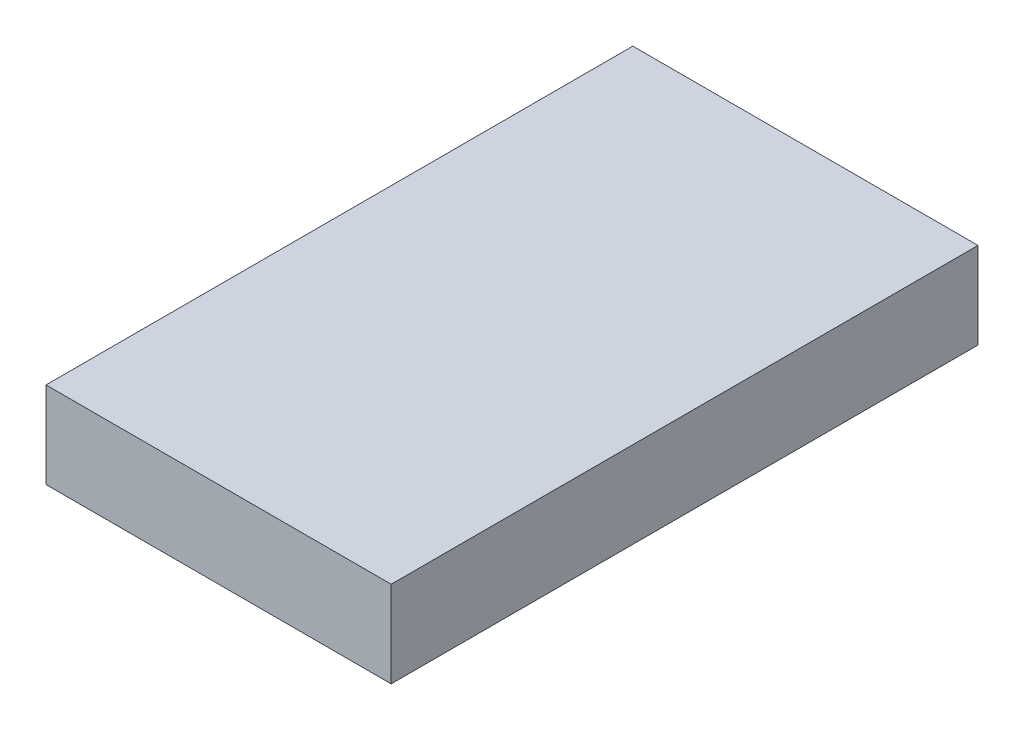
ISO-10303-21;
HEADER;
FILE_DESCRIPTION(('STEP AP214'),'2;1');
FILE_NAME('part.step','',(''),(''),'','','');
FILE_SCHEMA(('AUTOMOTIVE_DESIGN { 1 0 10303 214 1 1 1 1 }'));
ENDSEC;
DATA;
#1=APPLICATION_CONTEXT('core data for automotive mechanical design processes');
#2=APPLICATION_PROTOCOL_DEFINITION('international standard','automotive_design',2000,#1);
#3=PRODUCT_CONTEXT('',#1,'mechanical');
#4=PRODUCT('Part','Part','',(#3));
#5=PRODUCT_RELATED_PRODUCT_CATEGORY('part','',(#4));
#6=PRODUCT_DEFINITION_FORMATION('','',#4);
#7=PRODUCT_DEFINITION_CONTEXT('part definition',#1,'design');
#8=PRODUCT_DEFINITION('design','',#6,#7);
#9=PRODUCT_DEFINITION_SHAPE('','',#8);
#10=(LENGTH_UNIT() NAMED_UNIT(*) SI_UNIT(.MILLI.,.METRE.));
#11=(NAMED_UNIT(*) PLANE_ANGLE_UNIT() SI_UNIT($,.RADIAN.));
#12=(NAMED_UNIT(*) SI_UNIT($,.STERADIAN.) SOLID_ANGLE_UNIT());
#13=UNCERTAINTY_MEASURE_WITH_UNIT(LENGTH_MEASURE(1.E-05),#10,'distance_accuracy_value','');
#14=(GEOMETRIC_REPRESENTATION_CONTEXT(3) GLOBAL_UNCERTAINTY_ASSIGNED_CONTEXT((#13)) GLOBAL_UNIT_ASSIGNED_CONTEXT((#10,
#11,#12)) REPRESENTATION_CONTEXT('',''));
#15=CARTESIAN_POINT('',(0.,0.,0.));
#16=DIRECTION('',(0.,0.,1.));
#17=DIRECTION('',(1.,0.,0.));
#18=AXIS2_PLACEMENT_3D('',#15,#16,#17);
#19=CARTESIAN_POINT('',(52.,30.,102.));
#20=DIRECTION('',(-1.,0.,0.));
#21=DIRECTION('',(0.,0.,1.));
#22=AXIS2_PLACEMENT_3D('',#19,#20,#21);
#23=PLANE('',#22);
#24=DIRECTION('',(0.,-1.,0.));
#25=VECTOR('',#24,1.);
#26=CARTESIAN_POINT('',(52.,30.,-94.));
#27=LINE('',#26,#25);
#28=CARTESIAN_POINT('',(52.,22.,-94.));
#29=VERTEX_POINT('',#28);
#30=CARTESIAN_POINT('',(52.,0.,-94.));
#31=VERTEX_POINT('',#30);
#32=EDGE_CURVE('E195',#29,#31,#27,.T.);
#33=ORIENTED_EDGE('',*,*,#32,.T.);
#34=DIRECTION('',(0.,0.,1.));
#35=VECTOR('',#34,1.);
#36=CARTESIAN_POINT('',(52.,0.,94.));
#37=LINE('',#36,#35);
#38=CARTESIAN_POINT('',(52.,0.,94.));
#39=VERTEX_POINT('',#38);
#40=EDGE_CURVE('E143',#31,#39,#37,.T.);
#41=ORIENTED_EDGE('',*,*,#40,.T.);
#42=DIRECTION('',(0.,-1.,0.));
#43=VECTOR('',#42,1.);
#44=CARTESIAN_POINT('',(52.,30.,94.));
#45=LINE('',#44,#43);
#46=CARTESIAN_POINT('',(52.,22.,94.));
#47=VERTEX_POINT('',#46);
#48=EDGE_CURVE('E43',#47,#39,#45,.T.);
#49=ORIENTED_EDGE('',*,*,#48,.F.);
#50=DIRECTION('',(0.,0.,-1.));
#51=VECTOR('',#50,1.);
#52=CARTESIAN_POINT('',(52.,22.,0.));
#53=LINE('',#52,#51);
#54=EDGE_CURVE('E134',#47,#29,#53,.T.);
#55=ORIENTED_EDGE('',*,*,#54,.T.);
#56=EDGE_LOOP('',(#33,#41,#49,#55));
#57=FACE_BOUND('',#56,.T.);
#58=ADVANCED_FACE('F39',(#57),#23,.T.);
#59=CARTESIAN_POINT('',(-60.,30.,-94.));
#60=DIRECTION('',(0.,0.,1.));
#61=DIRECTION('',(1.,0.,0.));
#62=AXIS2_PLACEMENT_3D('',#59,#60,#61);
#63=PLANE('',#62);
#64=DIRECTION('',(0.,-1.,0.));
#65=VECTOR('',#64,1.);
#66=CARTESIAN_POINT('',(-52.,30.,-94.));
#67=LINE('',#66,#65);
#68=CARTESIAN_POINT('',(-52.,22.,-94.));
#69=VERTEX_POINT('',#68);
#70=CARTESIAN_POINT('',(-52.,0.,-94.));
#71=VERTEX_POINT('',#70);
#72=EDGE_CURVE('E135',#69,#71,#67,.T.);
#73=ORIENTED_EDGE('',*,*,#72,.T.);
#74=DIRECTION('',(1.,0.,0.));
#75=VECTOR('',#74,1.);
#76=CARTESIAN_POINT('',(52.,0.,-94.));
#77=LINE('',#76,#75);
#78=EDGE_CURVE('E148',#71,#31,#77,.T.);
#79=ORIENTED_EDGE('',*,*,#78,.T.);
#80=ORIENTED_EDGE('',*,*,#32,.F.);
#81=DIRECTION('',(-1.,0.,0.));
#82=VECTOR('',#81,1.);
#83=CARTESIAN_POINT('',(0.,22.,-94.));
#84=LINE('',#83,#82);
#85=EDGE_CURVE('E75',#29,#69,#84,.T.);
#86=ORIENTED_EDGE('',*,*,#85,.T.);
#87=EDGE_LOOP('',(#73,#79,#80,#86));
#88=FACE_BOUND('',#87,.T.);
#89=ADVANCED_FACE('F201',(#88),#63,.T.);
#90=CARTESIAN_POINT('',(-52.,30.,102.));
#91=DIRECTION('',(1.,0.,0.));
#92=DIRECTION('',(0.,0.,-1.));
#93=AXIS2_PLACEMENT_3D('',#90,#91,#92);
#94=PLANE('',#93);
#95=DIRECTION('',(0.,-1.,0.));
#96=VECTOR('',#95,1.);
#97=CARTESIAN_POINT('',(-52.,30.,94.));
#98=LINE('',#97,#96);
#99=CARTESIAN_POINT('',(-52.,22.,94.));
#100=VERTEX_POINT('',#99);
#101=CARTESIAN_POINT('',(-52.,0.,94.));
#102=VERTEX_POINT('',#101);
#103=EDGE_CURVE('E127',#100,#102,#98,.T.);
#104=ORIENTED_EDGE('',*,*,#103,.T.);
#105=DIRECTION('',(0.,0.,-1.));
#106=VECTOR('',#105,1.);
#107=CARTESIAN_POINT('',(-52.,0.,-94.));
#108=LINE('',#107,#106);
#109=EDGE_CURVE('E131',#102,#71,#108,.T.);
#110=ORIENTED_EDGE('',*,*,#109,.T.);
#111=ORIENTED_EDGE('',*,*,#72,.F.);
#112=DIRECTION('',(0.,0.,1.));
#113=VECTOR('',#112,1.);
#114=CARTESIAN_POINT('',(-52.,22.,0.));
#115=LINE('',#114,#113);
#116=EDGE_CURVE('E49',#69,#100,#115,.T.);
#117=ORIENTED_EDGE('',*,*,#116,.T.);
#118=EDGE_LOOP('',(#104,#110,#111,#117));
#119=FACE_BOUND('',#118,.T.);
#120=ADVANCED_FACE('F128',(#119),#94,.T.);
#121=CARTESIAN_POINT('',(-60.,30.,94.));
#122=DIRECTION('',(0.,0.,-1.));
#123=DIRECTION('',(-1.,0.,0.));
#124=AXIS2_PLACEMENT_3D('',#121,#122,#123);
#125=PLANE('',#124);
#126=ORIENTED_EDGE('',*,*,#48,.T.);
#127=DIRECTION('',(-1.,0.,0.));
#128=VECTOR('',#127,1.);
#129=CARTESIAN_POINT('',(-52.,0.,94.));
#130=LINE('',#129,#128);
#131=EDGE_CURVE('E138',#39,#102,#130,.T.);
#132=ORIENTED_EDGE('',*,*,#131,.T.);
#133=ORIENTED_EDGE('',*,*,#103,.F.);
#134=DIRECTION('',(1.,0.,0.));
#135=VECTOR('',#134,1.);
#136=CARTESIAN_POINT('',(0.,22.,94.));
#137=LINE('',#136,#135);
#138=EDGE_CURVE('E11',#100,#47,#137,.T.);
#139=ORIENTED_EDGE('',*,*,#138,.T.);
#140=EDGE_LOOP('',(#126,#132,#133,#139));
#141=FACE_BOUND('',#140,.T.);
#142=ADVANCED_FACE('F139',(#141),#125,.T.);
#143=CARTESIAN_POINT('',(0.,22.,0.));
#144=DIRECTION('',(0.,-1.,0.));
#145=DIRECTION('',(0.,0.,-1.));
#146=AXIS2_PLACEMENT_3D('',#143,#144,#145);
#147=PLANE('',#146);
#148=ORIENTED_EDGE('',*,*,#54,.F.);
#149=ORIENTED_EDGE('',*,*,#138,.F.);
#150=ORIENTED_EDGE('',*,*,#116,.F.);
#151=ORIENTED_EDGE('',*,*,#85,.F.);
#152=EDGE_LOOP('',(#148,#149,#150,#151));
#153=FACE_BOUND('',#152,.T.);
#154=ADVANCED_FACE('F41',(#153),#147,.T.);
#155=CARTESIAN_POINT('',(60.,30.,102.));
#156=DIRECTION('',(-1.,0.,0.));
#157=DIRECTION('',(0.,0.,1.));
#158=AXIS2_PLACEMENT_3D('',#155,#156,#157);
#159=PLANE('',#158);
#160=DIRECTION('',(0.,0.,-1.));
#161=VECTOR('',#160,1.);
#162=CARTESIAN_POINT('',(60.,0.,102.));
#163=LINE('',#162,#161);
#164=CARTESIAN_POINT('',(60.,0.,102.));
#165=VERTEX_POINT('',#164);
#166=CARTESIAN_POINT('',(60.,0.,-102.));
#167=VERTEX_POINT('',#166);
#168=EDGE_CURVE('E152',#165,#167,#163,.T.);
#169=ORIENTED_EDGE('',*,*,#168,.T.);
#170=DIRECTION('',(0.,-1.,0.));
#171=VECTOR('',#170,1.);
#172=CARTESIAN_POINT('',(60.,30.,-102.));
#173=LINE('',#172,#171);
#174=CARTESIAN_POINT('',(60.,30.,-102.));
#175=VERTEX_POINT('',#174);
#176=EDGE_CURVE('E185',#175,#167,#173,.T.);
#177=ORIENTED_EDGE('',*,*,#176,.F.);
#178=DIRECTION('',(0.,0.,-1.));
#179=VECTOR('',#178,1.);
#180=CARTESIAN_POINT('',(60.,30.,102.));
#181=LINE('',#180,#179);
#182=CARTESIAN_POINT('',(60.,30.,102.));
#183=VERTEX_POINT('',#182);
#184=EDGE_CURVE('E156',#183,#175,#181,.T.);
#185=ORIENTED_EDGE('',*,*,#184,.F.);
#186=DIRECTION('',(0.,-1.,0.));
#187=VECTOR('',#186,1.);
#188=CARTESIAN_POINT('',(60.,30.,102.));
#189=LINE('',#188,#187);
#190=EDGE_CURVE('E166',#183,#165,#189,.T.);
#191=ORIENTED_EDGE('',*,*,#190,.T.);
#192=EDGE_LOOP('',(#169,#177,#185,#191));
#193=FACE_BOUND('',#192,.T.);
#194=ADVANCED_FACE('F204',(#193),#159,.F.);
#195=CARTESIAN_POINT('',(-60.,30.,-102.));
#196=DIRECTION('',(0.,0.,1.));
#197=DIRECTION('',(1.,0.,0.));
#198=AXIS2_PLACEMENT_3D('',#195,#196,#197);
#199=PLANE('',#198);
#200=DIRECTION('',(-1.,0.,0.));
#201=VECTOR('',#200,1.);
#202=CARTESIAN_POINT('',(-60.,0.,-102.));
#203=LINE('',#202,#201);
#204=CARTESIAN_POINT('',(-60.,0.,-102.));
#205=VERTEX_POINT('',#204);
#206=EDGE_CURVE('E170',#167,#205,#203,.T.);
#207=ORIENTED_EDGE('',*,*,#206,.T.);
#208=DIRECTION('',(0.,-1.,0.));
#209=VECTOR('',#208,1.);
#210=CARTESIAN_POINT('',(-60.,30.,-102.));
#211=LINE('',#210,#209);
#212=CARTESIAN_POINT('',(-60.,30.,-102.));
#213=VERTEX_POINT('',#212);
#214=EDGE_CURVE('E182',#213,#205,#211,.T.);
#215=ORIENTED_EDGE('',*,*,#214,.F.);
#216=DIRECTION('',(-1.,0.,0.));
#217=VECTOR('',#216,1.);
#218=CARTESIAN_POINT('',(-60.,30.,-102.));
#219=LINE('',#218,#217);
#220=EDGE_CURVE('E116',#175,#213,#219,.T.);
#221=ORIENTED_EDGE('',*,*,#220,.F.);
#222=ORIENTED_EDGE('',*,*,#176,.T.);
#223=EDGE_LOOP('',(#207,#215,#221,#222));
#224=FACE_BOUND('',#223,.T.);
#225=ADVANCED_FACE('F209',(#224),#199,.F.);
#226=CARTESIAN_POINT('',(-60.,30.,102.));
#227=DIRECTION('',(1.,0.,0.));
#228=DIRECTION('',(0.,0.,-1.));
#229=AXIS2_PLACEMENT_3D('',#226,#227,#228);
#230=PLANE('',#229);
#231=DIRECTION('',(0.,0.,1.));
#232=VECTOR('',#231,1.);
#233=CARTESIAN_POINT('',(-60.,0.,102.));
#234=LINE('',#233,#232);
#235=CARTESIAN_POINT('',(-60.,0.,102.));
#236=VERTEX_POINT('',#235);
#237=EDGE_CURVE('E102',#205,#236,#234,.T.);
#238=ORIENTED_EDGE('',*,*,#237,.T.);
#239=DIRECTION('',(0.,-1.,0.));
#240=VECTOR('',#239,1.);
#241=CARTESIAN_POINT('',(-60.,30.,102.));
#242=LINE('',#241,#240);
#243=CARTESIAN_POINT('',(-60.,30.,102.));
#244=VERTEX_POINT('',#243);
#245=EDGE_CURVE('E179',#244,#236,#242,.T.);
#246=ORIENTED_EDGE('',*,*,#245,.F.);
#247=DIRECTION('',(0.,0.,1.));
#248=VECTOR('',#247,1.);
#249=CARTESIAN_POINT('',(-60.,30.,102.));
#250=LINE('',#249,#248);
#251=EDGE_CURVE('E161',#213,#244,#250,.T.);
#252=ORIENTED_EDGE('',*,*,#251,.F.);
#253=ORIENTED_EDGE('',*,*,#214,.T.);
#254=EDGE_LOOP('',(#238,#246,#252,#253));
#255=FACE_BOUND('',#254,.T.);
#256=ADVANCED_FACE('F255',(#255),#230,.F.);
#257=CARTESIAN_POINT('',(-60.,30.,102.));
#258=DIRECTION('',(0.,0.,-1.));
#259=DIRECTION('',(-1.,0.,0.));
#260=AXIS2_PLACEMENT_3D('',#257,#258,#259);
#261=PLANE('',#260);
#262=DIRECTION('',(1.,0.,0.));
#263=VECTOR('',#262,1.);
#264=CARTESIAN_POINT('',(-60.,0.,102.));
#265=LINE('',#264,#263);
#266=EDGE_CURVE('E108',#236,#165,#265,.T.);
#267=ORIENTED_EDGE('',*,*,#266,.T.);
#268=ORIENTED_EDGE('',*,*,#190,.F.);
#269=DIRECTION('',(1.,0.,0.));
#270=VECTOR('',#269,1.);
#271=CARTESIAN_POINT('',(-60.,30.,102.));
#272=LINE('',#271,#270);
#273=EDGE_CURVE('E84',#244,#183,#272,.T.);
#274=ORIENTED_EDGE('',*,*,#273,.F.);
#275=ORIENTED_EDGE('',*,*,#245,.T.);
#276=EDGE_LOOP('',(#267,#268,#274,#275));
#277=FACE_BOUND('',#276,.T.);
#278=ADVANCED_FACE('F249',(#277),#261,.F.);
#279=CARTESIAN_POINT('',(0.,30.,0.));
#280=DIRECTION('',(0.,-1.,0.));
#281=DIRECTION('',(0.,0.,-1.));
#282=AXIS2_PLACEMENT_3D('',#279,#280,#281);
#283=PLANE('',#282);
#284=ORIENTED_EDGE('',*,*,#184,.T.);
#285=ORIENTED_EDGE('',*,*,#220,.T.);
#286=ORIENTED_EDGE('',*,*,#251,.T.);
#287=ORIENTED_EDGE('',*,*,#273,.T.);
#288=EDGE_LOOP('',(#284,#285,#286,#287));
#289=FACE_BOUND('',#288,.T.);
#290=ADVANCED_FACE('F238',(#289),#283,.F.);
#291=CARTESIAN_POINT('',(0.,0.,0.));
#292=DIRECTION('',(0.,-1.,0.));
#293=DIRECTION('',(0.,0.,-1.));
#294=AXIS2_PLACEMENT_3D('',#291,#292,#293);
#295=PLANE('',#294);
#296=ORIENTED_EDGE('',*,*,#40,.F.);
#297=ORIENTED_EDGE('',*,*,#78,.F.);
#298=ORIENTED_EDGE('',*,*,#109,.F.);
#299=ORIENTED_EDGE('',*,*,#131,.F.);
#300=EDGE_LOOP('',(#296,#297,#298,#299));
#301=FACE_BOUND('',#300,.T.);
#302=ORIENTED_EDGE('',*,*,#168,.F.);
#303=ORIENTED_EDGE('',*,*,#266,.F.);
#304=ORIENTED_EDGE('',*,*,#237,.F.);
#305=ORIENTED_EDGE('',*,*,#206,.F.);
#306=EDGE_LOOP('',(#302,#303,#304,#305));
#307=FACE_BOUND('',#306,.T.);
#308=ADVANCED_FACE('F145',(#301,#307),#295,.T.);
#309=CLOSED_SHELL('',(#58,#89,#120,#142,#154,#194,#225,#256,#278,#290,#308));
#310=MANIFOLD_SOLID_BREP('B2',#309);
#311=ADVANCED_BREP_SHAPE_REPRESENTATION('',(#18,#310),#14);
#312=SHAPE_DEFINITION_REPRESENTATION(#9,#311);
ENDSEC;
END-ISO-10303-21;
